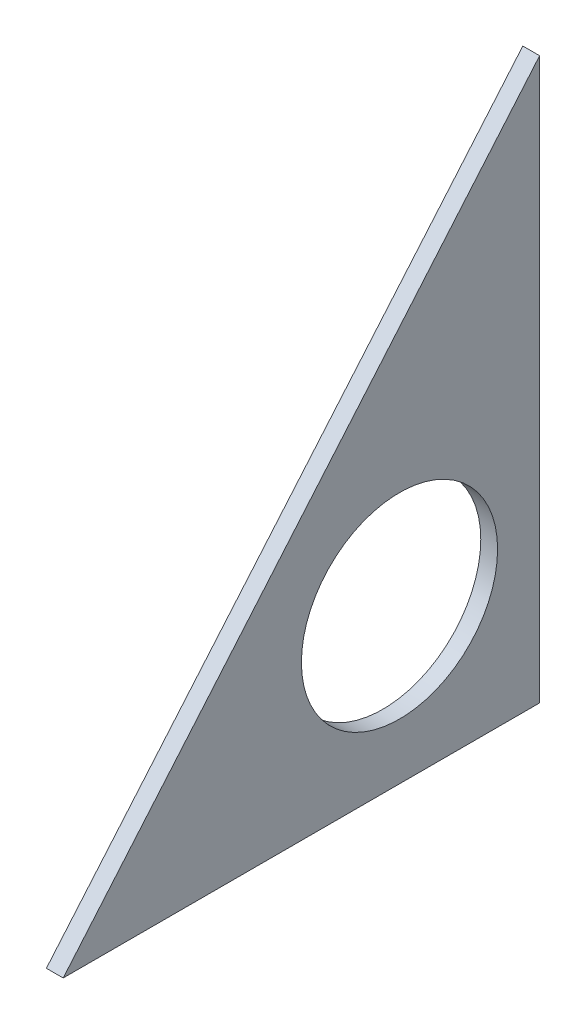
ISO-10303-21;
HEADER;
FILE_DESCRIPTION(('STEP AP214'),'2;1');
FILE_NAME('part.step','',(''),(''),'','','');
FILE_SCHEMA(('AUTOMOTIVE_DESIGN { 1 0 10303 214 1 1 1 1 }'));
ENDSEC;
DATA;
#1=APPLICATION_CONTEXT('core data for automotive mechanical design processes');
#2=APPLICATION_PROTOCOL_DEFINITION('international standard','automotive_design',2000,#1);
#3=PRODUCT_CONTEXT('',#1,'mechanical');
#4=PRODUCT('Part','Part','',(#3));
#5=PRODUCT_RELATED_PRODUCT_CATEGORY('part','',(#4));
#6=PRODUCT_DEFINITION_FORMATION('','',#4);
#7=PRODUCT_DEFINITION_CONTEXT('part definition',#1,'design');
#8=PRODUCT_DEFINITION('design','',#6,#7);
#9=PRODUCT_DEFINITION_SHAPE('','',#8);
#10=(LENGTH_UNIT() NAMED_UNIT(*) SI_UNIT(.MILLI.,.METRE.));
#11=(NAMED_UNIT(*) PLANE_ANGLE_UNIT() SI_UNIT($,.RADIAN.));
#12=(NAMED_UNIT(*) SI_UNIT($,.STERADIAN.) SOLID_ANGLE_UNIT());
#13=UNCERTAINTY_MEASURE_WITH_UNIT(LENGTH_MEASURE(1.E-05),#10,'distance_accuracy_value','');
#14=(GEOMETRIC_REPRESENTATION_CONTEXT(3) GLOBAL_UNCERTAINTY_ASSIGNED_CONTEXT((#13)) GLOBAL_UNIT_ASSIGNED_CONTEXT((#10,
#11,#12)) REPRESENTATION_CONTEXT('',''));
#15=CARTESIAN_POINT('',(0.,0.,0.));
#16=DIRECTION('',(0.,0.,1.));
#17=DIRECTION('',(1.,0.,0.));
#18=AXIS2_PLACEMENT_3D('',#15,#16,#17);
#19=CARTESIAN_POINT('',(6.,0.,0.));
#20=DIRECTION('',(1.,0.,0.));
#21=DIRECTION('',(0.,0.,-1.));
#22=AXIS2_PLACEMENT_3D('',#19,#20,#21);
#23=PLANE('',#22);
#24=DIRECTION('',(0.,-0.761939317759459,0.64764842009554));
#25=VECTOR('',#24,1.);
#26=CARTESIAN_POINT('',(6.,200.,-170.));
#27=LINE('',#26,#25);
#28=CARTESIAN_POINT('',(6.,200.,-170.));
#29=VERTEX_POINT('',#28);
#30=CARTESIAN_POINT('',(6.,0.,0.));
#31=VERTEX_POINT('',#30);
#32=EDGE_CURVE('E82',#29,#31,#27,.T.);
#33=ORIENTED_EDGE('',*,*,#32,.T.);
#34=DIRECTION('',(0.,0.,-1.));
#35=VECTOR('',#34,1.);
#36=CARTESIAN_POINT('',(6.,0.,0.));
#37=LINE('',#36,#35);
#38=CARTESIAN_POINT('',(6.,0.,-170.));
#39=VERTEX_POINT('',#38);
#40=EDGE_CURVE('E78',#31,#39,#37,.T.);
#41=ORIENTED_EDGE('',*,*,#40,.T.);
#42=DIRECTION('',(0.,1.,0.));
#43=VECTOR('',#42,1.);
#44=CARTESIAN_POINT('',(6.,0.,-170.));
#45=LINE('',#44,#43);
#46=EDGE_CURVE('E58',#39,#29,#45,.T.);
#47=ORIENTED_EDGE('',*,*,#46,.T.);
#48=EDGE_LOOP('',(#33,#41,#47));
#49=FACE_BOUND('',#48,.T.);
#50=CARTESIAN_POINT('',(6.,55.,-120.));
#51=DIRECTION('',(1.,0.,0.));
#52=DIRECTION('',(0.,0.,-1.));
#53=AXIS2_PLACEMENT_3D('',#50,#51,#52);
#54=CIRCLE('',#53,35.);
#55=CARTESIAN_POINT('',(6.,55.,-155.));
#56=VERTEX_POINT('',#55);
#57=EDGE_CURVE('E92',#56,#56,#54,.T.);
#58=ORIENTED_EDGE('',*,*,#57,.F.);
#59=EDGE_LOOP('',(#58));
#60=FACE_BOUND('',#59,.T.);
#61=ADVANCED_FACE('F41',(#49,#60),#23,.T.);
#62=CARTESIAN_POINT('',(0.,0.,0.));
#63=DIRECTION('',(1.,0.,0.));
#64=DIRECTION('',(0.,0.,-1.));
#65=AXIS2_PLACEMENT_3D('',#62,#63,#64);
#66=PLANE('',#65);
#67=DIRECTION('',(0.,-0.761939317759459,0.64764842009554));
#68=VECTOR('',#67,1.);
#69=CARTESIAN_POINT('',(0.,200.,-170.));
#70=LINE('',#69,#68);
#71=CARTESIAN_POINT('',(0.,200.,-170.));
#72=VERTEX_POINT('',#71);
#73=CARTESIAN_POINT('',(0.,0.,0.));
#74=VERTEX_POINT('',#73);
#75=EDGE_CURVE('E89',#72,#74,#70,.T.);
#76=ORIENTED_EDGE('',*,*,#75,.F.);
#77=DIRECTION('',(0.,1.,0.));
#78=VECTOR('',#77,1.);
#79=CARTESIAN_POINT('',(0.,0.,-170.));
#80=LINE('',#79,#78);
#81=CARTESIAN_POINT('',(0.,0.,-170.));
#82=VERTEX_POINT('',#81);
#83=EDGE_CURVE('E75',#82,#72,#80,.T.);
#84=ORIENTED_EDGE('',*,*,#83,.F.);
#85=DIRECTION('',(0.,0.,-1.));
#86=VECTOR('',#85,1.);
#87=CARTESIAN_POINT('',(0.,0.,0.));
#88=LINE('',#87,#86);
#89=EDGE_CURVE('E70',#74,#82,#88,.T.);
#90=ORIENTED_EDGE('',*,*,#89,.F.);
#91=EDGE_LOOP('',(#76,#84,#90));
#92=FACE_BOUND('',#91,.T.);
#93=CARTESIAN_POINT('',(0.,55.,-120.));
#94=DIRECTION('',(1.,0.,0.));
#95=DIRECTION('',(0.,0.,-1.));
#96=AXIS2_PLACEMENT_3D('',#93,#94,#95);
#97=CIRCLE('',#96,35.);
#98=CARTESIAN_POINT('',(0.,55.,-155.));
#99=VERTEX_POINT('',#98);
#100=EDGE_CURVE('E96',#99,#99,#97,.T.);
#101=ORIENTED_EDGE('',*,*,#100,.T.);
#102=EDGE_LOOP('',(#101));
#103=FACE_BOUND('',#102,.T.);
#104=ADVANCED_FACE('F102',(#92,#103),#66,.F.);
#105=CARTESIAN_POINT('',(6.,200.,-170.));
#106=DIRECTION('',(0.,-0.64764842009554,-0.761939317759459));
#107=DIRECTION('',(0.,0.761939317759459,-0.647648420095541));
#108=AXIS2_PLACEMENT_3D('',#105,#106,#107);
#109=PLANE('',#108);
#110=ORIENTED_EDGE('',*,*,#75,.T.);
#111=DIRECTION('',(-1.,0.,0.));
#112=VECTOR('',#111,1.);
#113=CARTESIAN_POINT('',(6.,0.,0.));
#114=LINE('',#113,#112);
#115=EDGE_CURVE('E11',#31,#74,#114,.T.);
#116=ORIENTED_EDGE('',*,*,#115,.F.);
#117=ORIENTED_EDGE('',*,*,#32,.F.);
#118=DIRECTION('',(-1.,0.,0.));
#119=VECTOR('',#118,1.);
#120=CARTESIAN_POINT('',(6.,200.,-170.));
#121=LINE('',#120,#119);
#122=EDGE_CURVE('E90',#29,#72,#121,.T.);
#123=ORIENTED_EDGE('',*,*,#122,.T.);
#124=EDGE_LOOP('',(#110,#116,#117,#123));
#125=FACE_BOUND('',#124,.T.);
#126=ADVANCED_FACE('F43',(#125),#109,.F.);
#127=CARTESIAN_POINT('',(6.,0.,0.));
#128=DIRECTION('',(0.,1.,0.));
#129=DIRECTION('',(0.,0.,1.));
#130=AXIS2_PLACEMENT_3D('',#127,#128,#129);
#131=PLANE('',#130);
#132=ORIENTED_EDGE('',*,*,#89,.T.);
#133=DIRECTION('',(-1.,0.,0.));
#134=VECTOR('',#133,1.);
#135=CARTESIAN_POINT('',(6.,0.,-170.));
#136=LINE('',#135,#134);
#137=EDGE_CURVE('E50',#39,#82,#136,.T.);
#138=ORIENTED_EDGE('',*,*,#137,.F.);
#139=ORIENTED_EDGE('',*,*,#40,.F.);
#140=ORIENTED_EDGE('',*,*,#115,.T.);
#141=EDGE_LOOP('',(#132,#138,#139,#140));
#142=FACE_BOUND('',#141,.T.);
#143=ADVANCED_FACE('F79',(#142),#131,.F.);
#144=CARTESIAN_POINT('',(6.,0.,-170.));
#145=DIRECTION('',(0.,0.,1.));
#146=DIRECTION('',(1.,0.,0.));
#147=AXIS2_PLACEMENT_3D('',#144,#145,#146);
#148=PLANE('',#147);
#149=ORIENTED_EDGE('',*,*,#83,.T.);
#150=ORIENTED_EDGE('',*,*,#122,.F.);
#151=ORIENTED_EDGE('',*,*,#46,.F.);
#152=ORIENTED_EDGE('',*,*,#137,.T.);
#153=EDGE_LOOP('',(#149,#150,#151,#152));
#154=FACE_BOUND('',#153,.T.);
#155=ADVANCED_FACE('F101',(#154),#148,.F.);
#156=CARTESIAN_POINT('',(6.,55.,-120.));
#157=DIRECTION('',(-1.,0.,0.));
#158=DIRECTION('',(0.,0.,1.));
#159=AXIS2_PLACEMENT_3D('',#156,#157,#158);
#160=CYLINDRICAL_SURFACE('',#159,35.);
#161=ORIENTED_EDGE('',*,*,#57,.T.);
#162=EDGE_LOOP('',(#161));
#163=FACE_BOUND('',#162,.T.);
#164=ORIENTED_EDGE('',*,*,#100,.F.);
#165=EDGE_LOOP('',(#164));
#166=FACE_BOUND('',#165,.T.);
#167=ADVANCED_FACE('F110',(#163,#166),#160,.F.);
#168=CLOSED_SHELL('',(#61,#104,#126,#143,#155,#167));
#169=MANIFOLD_SOLID_BREP('B2',#168);
#170=ADVANCED_BREP_SHAPE_REPRESENTATION('',(#18,#169),#14);
#171=SHAPE_DEFINITION_REPRESENTATION(#9,#170);
ENDSEC;
END-ISO-10303-21;
